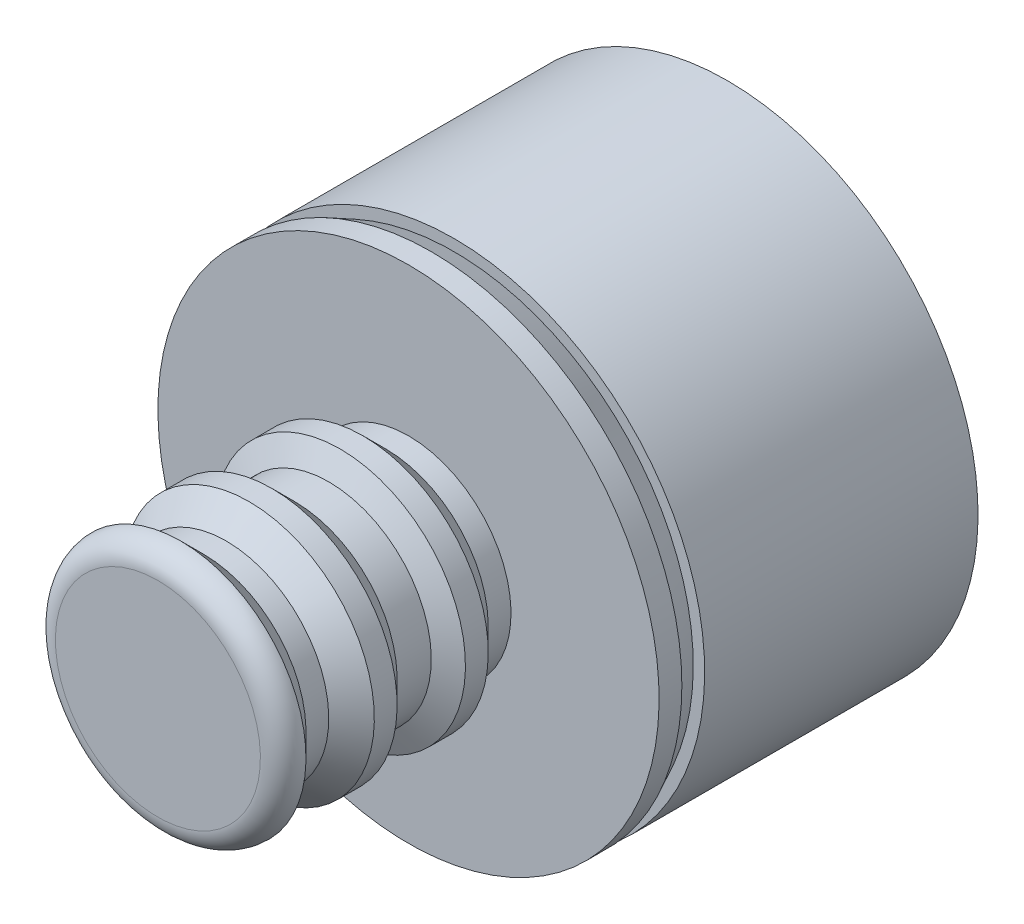
ISO-10303-21;
HEADER;
FILE_DESCRIPTION(('STEP AP214'),'2;1');
FILE_NAME('part.step','',(''),(''),'','','');
FILE_SCHEMA(('AUTOMOTIVE_DESIGN { 1 0 10303 214 1 1 1 1 }'));
ENDSEC;
DATA;
#1=APPLICATION_CONTEXT('core data for automotive mechanical design processes');
#2=APPLICATION_PROTOCOL_DEFINITION('international standard','automotive_design',2000,#1);
#3=PRODUCT_CONTEXT('',#1,'mechanical');
#4=PRODUCT('Part','Part','',(#3));
#5=PRODUCT_RELATED_PRODUCT_CATEGORY('part','',(#4));
#6=PRODUCT_DEFINITION_FORMATION('','',#4);
#7=PRODUCT_DEFINITION_CONTEXT('part definition',#1,'design');
#8=PRODUCT_DEFINITION('design','',#6,#7);
#9=PRODUCT_DEFINITION_SHAPE('','',#8);
#10=(LENGTH_UNIT() NAMED_UNIT(*) SI_UNIT(.MILLI.,.METRE.));
#11=(NAMED_UNIT(*) PLANE_ANGLE_UNIT() SI_UNIT($,.RADIAN.));
#12=(NAMED_UNIT(*) SI_UNIT($,.STERADIAN.) SOLID_ANGLE_UNIT());
#13=UNCERTAINTY_MEASURE_WITH_UNIT(LENGTH_MEASURE(1.E-05),#10,'distance_accuracy_value','');
#14=(GEOMETRIC_REPRESENTATION_CONTEXT(3) GLOBAL_UNCERTAINTY_ASSIGNED_CONTEXT((#13)) GLOBAL_UNIT_ASSIGNED_CONTEXT((#10,
#11,#12)) REPRESENTATION_CONTEXT('',''));
#15=CARTESIAN_POINT('',(0.,0.,0.));
#16=DIRECTION('',(0.,0.,1.));
#17=DIRECTION('',(1.,0.,0.));
#18=AXIS2_PLACEMENT_3D('',#15,#16,#17);
#19=CARTESIAN_POINT('',(0.,5.25,27.));
#20=DIRECTION('',(0.,0.,1.));
#21=DIRECTION('',(0.,-1.,0.));
#22=AXIS2_PLACEMENT_3D('',#19,#20,#21);
#23=PLANE('',#22);
#24=CARTESIAN_POINT('',(0.,2.5,27.));
#25=DIRECTION('',(0.,0.,-1.));
#26=DIRECTION('',(0.,1.,0.));
#27=AXIS2_PLACEMENT_3D('',#24,#25,#26);
#28=CIRCLE('',#27,4.5);
#29=CARTESIAN_POINT('',(0.,7.,27.));
#30=VERTEX_POINT('',#29);
#31=EDGE_CURVE('E103',#30,#30,#28,.T.);
#32=ORIENTED_EDGE('',*,*,#31,.F.);
#33=EDGE_LOOP('',(#32));
#34=FACE_BOUND('',#33,.T.);
#35=ADVANCED_FACE('F14',(#34),#23,.T.);
#36=CARTESIAN_POINT('',(0.,2.5,26.));
#37=DIRECTION('',(0.,0.,-1.));
#38=DIRECTION('',(-1.,0.,0.));
#39=AXIS2_PLACEMENT_3D('',#36,#37,#38);
#40=TOROIDAL_SURFACE('',#39,4.5,1.);
#41=CARTESIAN_POINT('',(0.,2.5,26.0000000000105));
#42=DIRECTION('',(0.,0.,1.));
#43=DIRECTION('',(0.,1.,0.));
#44=AXIS2_PLACEMENT_3D('',#41,#42,#43);
#45=CIRCLE('',#44,5.5000000000382);
#46=CARTESIAN_POINT('',(0.,8.0000000000382,26.0000000000105));
#47=VERTEX_POINT('',#46);
#48=EDGE_CURVE('E98',#47,#47,#45,.F.);
#49=ORIENTED_EDGE('',*,*,#48,.F.);
#50=EDGE_LOOP('',(#49));
#51=FACE_BOUND('',#50,.T.);
#52=ORIENTED_EDGE('',*,*,#31,.T.);
#53=EDGE_LOOP('',(#52));
#54=FACE_BOUND('',#53,.T.);
#55=ADVANCED_FACE('F110',(#51,#54),#40,.T.);
#56=CARTESIAN_POINT('',(0.,2.5,26.0000000000105));
#57=DIRECTION('',(0.,0.,1.));
#58=DIRECTION('',(0.,-1.,0.));
#59=AXIS2_PLACEMENT_3D('',#56,#57,#58);
#60=CONICAL_SURFACE('',#59,5.5000000000382,0.785398163397448);
#61=ORIENTED_EDGE('',*,*,#48,.T.);
#62=EDGE_LOOP('',(#61));
#63=FACE_BOUND('',#62,.T.);
#64=CARTESIAN_POINT('',(0.,2.5,25.));
#65=DIRECTION('',(0.,0.,-1.));
#66=DIRECTION('',(0.,1.,0.));
#67=AXIS2_PLACEMENT_3D('',#64,#65,#66);
#68=CIRCLE('',#67,4.5);
#69=CARTESIAN_POINT('',(0.,7.,25.));
#70=VERTEX_POINT('',#69);
#71=EDGE_CURVE('E93',#70,#70,#68,.T.);
#72=ORIENTED_EDGE('',*,*,#71,.F.);
#73=EDGE_LOOP('',(#72));
#74=FACE_BOUND('',#73,.T.);
#75=ADVANCED_FACE('F114',(#63,#74),#60,.T.);
#76=CARTESIAN_POINT('',(0.,2.5,24.5));
#77=DIRECTION('',(0.,0.,-1.));
#78=DIRECTION('',(0.,1.,0.));
#79=AXIS2_PLACEMENT_3D('',#76,#77,#78);
#80=CYLINDRICAL_SURFACE('',#79,4.5);
#81=ORIENTED_EDGE('',*,*,#71,.T.);
#82=EDGE_LOOP('',(#81));
#83=FACE_BOUND('',#82,.T.);
#84=CARTESIAN_POINT('',(0.,2.5,23.9999999999441));
#85=DIRECTION('',(0.,0.,-1.));
#86=DIRECTION('',(0.,1.,0.));
#87=AXIS2_PLACEMENT_3D('',#84,#85,#86);
#88=CIRCLE('',#87,4.500000000005);
#89=CARTESIAN_POINT('',(0.,7.000000000005,23.9999999999441));
#90=VERTEX_POINT('',#89);
#91=EDGE_CURVE('E88',#90,#90,#88,.T.);
#92=ORIENTED_EDGE('',*,*,#91,.F.);
#93=EDGE_LOOP('',(#92));
#94=FACE_BOUND('',#93,.T.);
#95=ADVANCED_FACE('F118',(#83,#94),#80,.T.);
#96=CARTESIAN_POINT('',(0.,2.5,23.0000000000246));
#97=DIRECTION('',(0.,0.,-1.));
#98=DIRECTION('',(0.,1.,0.));
#99=AXIS2_PLACEMENT_3D('',#96,#97,#98);
#100=CONICAL_SURFACE('',#99,5.49999999992451,0.785398163397448);
#101=ORIENTED_EDGE('',*,*,#91,.T.);
#102=EDGE_LOOP('',(#101));
#103=FACE_BOUND('',#102,.T.);
#104=CARTESIAN_POINT('',(0.,2.5,23.));
#105=DIRECTION('',(0.,0.,-1.));
#106=DIRECTION('',(0.,1.,0.));
#107=AXIS2_PLACEMENT_3D('',#104,#105,#106);
#108=CIRCLE('',#107,5.5);
#109=CARTESIAN_POINT('',(0.,8.,23.));
#110=VERTEX_POINT('',#109);
#111=EDGE_CURVE('E83',#110,#110,#108,.T.);
#112=ORIENTED_EDGE('',*,*,#111,.F.);
#113=EDGE_LOOP('',(#112));
#114=FACE_BOUND('',#113,.T.);
#115=ADVANCED_FACE('F122',(#103,#114),#100,.T.);
#116=CARTESIAN_POINT('',(0.,2.5,22.5));
#117=DIRECTION('',(0.,0.,-1.));
#118=DIRECTION('',(0.,1.,0.));
#119=AXIS2_PLACEMENT_3D('',#116,#117,#118);
#120=CYLINDRICAL_SURFACE('',#119,5.5);
#121=ORIENTED_EDGE('',*,*,#111,.T.);
#122=EDGE_LOOP('',(#121));
#123=FACE_BOUND('',#122,.T.);
#124=CARTESIAN_POINT('',(0.,2.5,21.9999999999914));
#125=DIRECTION('',(0.,0.,1.));
#126=DIRECTION('',(0.,1.,0.));
#127=AXIS2_PLACEMENT_3D('',#124,#125,#126);
#128=CIRCLE('',#127,5.5000000000382);
#129=CARTESIAN_POINT('',(0.,8.0000000000382,21.9999999999914));
#130=VERTEX_POINT('',#129);
#131=EDGE_CURVE('E78',#130,#130,#128,.F.);
#132=ORIENTED_EDGE('',*,*,#131,.F.);
#133=EDGE_LOOP('',(#132));
#134=FACE_BOUND('',#133,.T.);
#135=ADVANCED_FACE('F126',(#123,#134),#120,.T.);
#136=CARTESIAN_POINT('',(0.,2.5,21.9999999999914));
#137=DIRECTION('',(0.,0.,1.));
#138=DIRECTION('',(0.,-1.,0.));
#139=AXIS2_PLACEMENT_3D('',#136,#137,#138);
#140=CONICAL_SURFACE('',#139,5.5000000000382,0.785398163397448);
#141=ORIENTED_EDGE('',*,*,#131,.T.);
#142=EDGE_LOOP('',(#141));
#143=FACE_BOUND('',#142,.T.);
#144=CARTESIAN_POINT('',(0.,2.5,21.));
#145=DIRECTION('',(0.,0.,-1.));
#146=DIRECTION('',(0.,1.,0.));
#147=AXIS2_PLACEMENT_3D('',#144,#145,#146);
#148=CIRCLE('',#147,4.5);
#149=CARTESIAN_POINT('',(0.,7.,21.));
#150=VERTEX_POINT('',#149);
#151=EDGE_CURVE('E73',#150,#150,#148,.T.);
#152=ORIENTED_EDGE('',*,*,#151,.F.);
#153=EDGE_LOOP('',(#152));
#154=FACE_BOUND('',#153,.T.);
#155=ADVANCED_FACE('F130',(#143,#154),#140,.T.);
#156=CARTESIAN_POINT('',(0.,2.5,20.25));
#157=DIRECTION('',(0.,0.,-1.));
#158=DIRECTION('',(0.,1.,0.));
#159=AXIS2_PLACEMENT_3D('',#156,#157,#158);
#160=CYLINDRICAL_SURFACE('',#159,4.5);
#161=ORIENTED_EDGE('',*,*,#151,.T.);
#162=EDGE_LOOP('',(#161));
#163=FACE_BOUND('',#162,.T.);
#164=CARTESIAN_POINT('',(0.,2.5,19.4999999999936));
#165=DIRECTION('',(0.,0.,-1.));
#166=DIRECTION('',(0.,1.,0.));
#167=AXIS2_PLACEMENT_3D('',#164,#165,#166);
#168=CIRCLE('',#167,4.500000000005);
#169=CARTESIAN_POINT('',(0.,7.000000000005,19.4999999999936));
#170=VERTEX_POINT('',#169);
#171=EDGE_CURVE('E68',#170,#170,#168,.T.);
#172=ORIENTED_EDGE('',*,*,#171,.F.);
#173=EDGE_LOOP('',(#172));
#174=FACE_BOUND('',#173,.T.);
#175=ADVANCED_FACE('F134',(#163,#174),#160,.T.);
#176=CARTESIAN_POINT('',(0.,2.5,19.0000000000339));
#177=DIRECTION('',(0.,0.,-1.));
#178=DIRECTION('',(0.,1.,0.));
#179=AXIS2_PLACEMENT_3D('',#176,#177,#178);
#180=CONICAL_SURFACE('',#179,5.49999999986767,1.10714871777135);
#181=ORIENTED_EDGE('',*,*,#171,.T.);
#182=EDGE_LOOP('',(#181));
#183=FACE_BOUND('',#182,.T.);
#184=CARTESIAN_POINT('',(0.,2.5,19.));
#185=DIRECTION('',(0.,0.,-1.));
#186=DIRECTION('',(0.,1.,0.));
#187=AXIS2_PLACEMENT_3D('',#184,#185,#186);
#188=CIRCLE('',#187,5.49999999999999);
#189=CARTESIAN_POINT('',(0.,7.99999999999999,19.));
#190=VERTEX_POINT('',#189);
#191=EDGE_CURVE('E56',#190,#190,#188,.T.);
#192=ORIENTED_EDGE('',*,*,#191,.F.);
#193=EDGE_LOOP('',(#192));
#194=FACE_BOUND('',#193,.T.);
#195=ADVANCED_FACE('F138',(#183,#194),#180,.T.);
#196=CARTESIAN_POINT('',(0.,2.5,18.5));
#197=DIRECTION('',(0.,0.,-1.));
#198=DIRECTION('',(0.,1.,0.));
#199=AXIS2_PLACEMENT_3D('',#196,#197,#198);
#200=CYLINDRICAL_SURFACE('',#199,5.49999999999999);
#201=ORIENTED_EDGE('',*,*,#191,.T.);
#202=EDGE_LOOP('',(#201));
#203=FACE_BOUND('',#202,.T.);
#204=CARTESIAN_POINT('',(0.,2.5,18.0000000000291));
#205=DIRECTION('',(0.,0.,1.));
#206=DIRECTION('',(0.,1.,0.));
#207=AXIS2_PLACEMENT_3D('',#204,#205,#206);
#208=CIRCLE('',#207,5.5000000000382);
#209=CARTESIAN_POINT('',(0.,8.0000000000382,18.0000000000291));
#210=VERTEX_POINT('',#209);
#211=EDGE_CURVE('E51',#210,#210,#208,.F.);
#212=ORIENTED_EDGE('',*,*,#211,.F.);
#213=EDGE_LOOP('',(#212));
#214=FACE_BOUND('',#213,.T.);
#215=ADVANCED_FACE('F142',(#203,#214),#200,.T.);
#216=CARTESIAN_POINT('',(0.,2.5,18.0000000000291));
#217=DIRECTION('',(0.,0.,1.));
#218=DIRECTION('',(0.,-1.,0.));
#219=AXIS2_PLACEMENT_3D('',#216,#217,#218);
#220=CONICAL_SURFACE('',#219,5.5000000000382,0.785398163369027);
#221=ORIENTED_EDGE('',*,*,#211,.T.);
#222=EDGE_LOOP('',(#221));
#223=FACE_BOUND('',#222,.T.);
#224=CARTESIAN_POINT('',(0.,2.5,17.));
#225=DIRECTION('',(0.,0.,-1.));
#226=DIRECTION('',(0.,1.,0.));
#227=AXIS2_PLACEMENT_3D('',#224,#225,#226);
#228=CIRCLE('',#227,4.49999999999999);
#229=CARTESIAN_POINT('',(0.,6.99999999999999,17.));
#230=VERTEX_POINT('',#229);
#231=EDGE_CURVE('E47',#230,#230,#228,.T.);
#232=ORIENTED_EDGE('',*,*,#231,.F.);
#233=EDGE_LOOP('',(#232));
#234=FACE_BOUND('',#233,.T.);
#235=ADVANCED_FACE('F146',(#223,#234),#220,.T.);
#236=CARTESIAN_POINT('',(0.,2.5,16.5));
#237=DIRECTION('',(0.,0.,-1.));
#238=DIRECTION('',(0.,1.,0.));
#239=AXIS2_PLACEMENT_3D('',#236,#237,#238);
#240=CYLINDRICAL_SURFACE('',#239,4.49999999999999);
#241=ORIENTED_EDGE('',*,*,#231,.T.);
#242=EDGE_LOOP('',(#241));
#243=FACE_BOUND('',#242,.T.);
#244=CARTESIAN_POINT('',(0.,2.5,16.));
#245=DIRECTION('',(0.,0.,-1.));
#246=DIRECTION('',(0.,1.,0.));
#247=AXIS2_PLACEMENT_3D('',#244,#245,#246);
#248=CIRCLE('',#247,4.49999999999999);
#249=CARTESIAN_POINT('',(0.,6.99999999999999,16.));
#250=VERTEX_POINT('',#249);
#251=EDGE_CURVE('E18',#250,#250,#248,.T.);
#252=ORIENTED_EDGE('',*,*,#251,.F.);
#253=EDGE_LOOP('',(#252));
#254=FACE_BOUND('',#253,.T.);
#255=ADVANCED_FACE('F150',(#243,#254),#240,.T.);
#256=CARTESIAN_POINT('',(0.,10.25,16.));
#257=DIRECTION('',(0.,0.,1.));
#258=DIRECTION('',(0.,-1.,0.));
#259=AXIS2_PLACEMENT_3D('',#256,#257,#258);
#260=PLANE('',#259);
#261=ORIENTED_EDGE('',*,*,#251,.T.);
#262=EDGE_LOOP('',(#261));
#263=FACE_BOUND('',#262,.T.);
#264=CARTESIAN_POINT('',(0.,2.5,16.));
#265=DIRECTION('',(0.,0.,-1.));
#266=DIRECTION('',(0.,1.,0.));
#267=AXIS2_PLACEMENT_3D('',#264,#265,#266);
#268=CIRCLE('',#267,11.);
#269=CARTESIAN_POINT('',(0.,13.5,16.));
#270=VERTEX_POINT('',#269);
#271=EDGE_CURVE('E42',#270,#270,#268,.T.);
#272=ORIENTED_EDGE('',*,*,#271,.F.);
#273=EDGE_LOOP('',(#272));
#274=FACE_BOUND('',#273,.T.);
#275=ADVANCED_FACE('F154',(#263,#274),#260,.T.);
#276=CARTESIAN_POINT('',(0.,7.5,10.));
#277=DIRECTION('',(0.,0.,-1.));
#278=DIRECTION('',(0.,1.,0.));
#279=AXIS2_PLACEMENT_3D('',#276,#277,#278);
#280=PLANE('',#279);
#281=CARTESIAN_POINT('',(0.,2.5,10.));
#282=DIRECTION('',(0.,0.,-1.));
#283=DIRECTION('',(0.,1.,0.));
#284=AXIS2_PLACEMENT_3D('',#281,#282,#283);
#285=CIRCLE('',#284,10.);
#286=CARTESIAN_POINT('',(0.,12.5,10.));
#287=VERTEX_POINT('',#286);
#288=EDGE_CURVE('E40',#287,#287,#285,.T.);
#289=ORIENTED_EDGE('',*,*,#288,.T.);
#290=EDGE_LOOP('',(#289));
#291=FACE_BOUND('',#290,.T.);
#292=ADVANCED_FACE('F157',(#291),#280,.T.);
#293=CARTESIAN_POINT('',(0.,2.5,15.5));
#294=DIRECTION('',(0.,0.,-1.));
#295=DIRECTION('',(0.,1.,0.));
#296=AXIS2_PLACEMENT_3D('',#293,#294,#295);
#297=CYLINDRICAL_SURFACE('',#296,11.);
#298=ORIENTED_EDGE('',*,*,#271,.T.);
#299=EDGE_LOOP('',(#298));
#300=FACE_BOUND('',#299,.T.);
#301=CARTESIAN_POINT('',(0.,2.5,15.));
#302=DIRECTION('',(0.,0.,1.));
#303=DIRECTION('',(0.,1.,0.));
#304=AXIS2_PLACEMENT_3D('',#301,#302,#303);
#305=CIRCLE('',#304,11.);
#306=CARTESIAN_POINT('',(0.,13.5,15.));
#307=VERTEX_POINT('',#306);
#308=EDGE_CURVE('E39',#307,#307,#305,.F.);
#309=ORIENTED_EDGE('',*,*,#308,.F.);
#310=EDGE_LOOP('',(#309));
#311=FACE_BOUND('',#310,.T.);
#312=ADVANCED_FACE('F160',(#300,#311),#297,.T.);
#313=CARTESIAN_POINT('',(0.,2.5,6.00000000000001));
#314=DIRECTION('',(0.,0.,-1.));
#315=DIRECTION('',(0.,1.,0.));
#316=AXIS2_PLACEMENT_3D('',#313,#314,#315);
#317=CYLINDRICAL_SURFACE('',#316,10.);
#318=CARTESIAN_POINT('',(0.,2.5,2.00000000000002));
#319=DIRECTION('',(0.,0.,-1.));
#320=DIRECTION('',(0.,1.,0.));
#321=AXIS2_PLACEMENT_3D('',#318,#319,#320);
#322=CIRCLE('',#321,10.);
#323=CARTESIAN_POINT('',(0.,12.5,2.00000000000002));
#324=VERTEX_POINT('',#323);
#325=EDGE_CURVE('E36',#324,#324,#322,.F.);
#326=ORIENTED_EDGE('',*,*,#325,.F.);
#327=EDGE_LOOP('',(#326));
#328=FACE_BOUND('',#327,.T.);
#329=ORIENTED_EDGE('',*,*,#288,.F.);
#330=EDGE_LOOP('',(#329));
#331=FACE_BOUND('',#330,.T.);
#332=ADVANCED_FACE('F164',(#328,#331),#317,.F.);
#333=CARTESIAN_POINT('',(0.,2.5,15.));
#334=DIRECTION('',(0.,0.,1.));
#335=DIRECTION('',(0.,-1.,0.));
#336=AXIS2_PLACEMENT_3D('',#333,#334,#335);
#337=CONICAL_SURFACE('',#336,11.,0.46364760900081);
#338=ORIENTED_EDGE('',*,*,#308,.T.);
#339=EDGE_LOOP('',(#338));
#340=FACE_BOUND('',#339,.T.);
#341=CARTESIAN_POINT('',(0.,2.5,14.));
#342=DIRECTION('',(0.,0.,1.));
#343=DIRECTION('',(0.,-1.,0.));
#344=AXIS2_PLACEMENT_3D('',#341,#342,#343);
#345=CIRCLE('',#344,10.5);
#346=CARTESIAN_POINT('',(0.,-8.,14.));
#347=VERTEX_POINT('',#346);
#348=EDGE_CURVE('E27',#347,#347,#345,.F.);
#349=ORIENTED_EDGE('',*,*,#348,.F.);
#350=EDGE_LOOP('',(#349));
#351=FACE_BOUND('',#350,.T.);
#352=ADVANCED_FACE('F167',(#340,#351),#337,.T.);
#353=CARTESIAN_POINT('',(0.,13.,2.00000000000002));
#354=DIRECTION('',(0.,0.,-1.));
#355=DIRECTION('',(0.,1.,0.));
#356=AXIS2_PLACEMENT_3D('',#353,#354,#355);
#357=PLANE('',#356);
#358=ORIENTED_EDGE('',*,*,#325,.T.);
#359=EDGE_LOOP('',(#358));
#360=FACE_BOUND('',#359,.T.);
#361=CARTESIAN_POINT('',(0.,2.5,2.00000000000002));
#362=DIRECTION('',(0.,0.,-1.));
#363=DIRECTION('',(0.,1.,0.));
#364=AXIS2_PLACEMENT_3D('',#361,#362,#363);
#365=CIRCLE('',#364,11.);
#366=CARTESIAN_POINT('',(0.,13.5,2.00000000000002));
#367=VERTEX_POINT('',#366);
#368=EDGE_CURVE('E22',#367,#367,#365,.F.);
#369=ORIENTED_EDGE('',*,*,#368,.F.);
#370=EDGE_LOOP('',(#369));
#371=FACE_BOUND('',#370,.T.);
#372=ADVANCED_FACE('F171',(#360,#371),#357,.T.);
#373=CARTESIAN_POINT('',(0.,13.25,14.));
#374=DIRECTION('',(0.,0.,1.));
#375=DIRECTION('',(0.,-1.,0.));
#376=AXIS2_PLACEMENT_3D('',#373,#374,#375);
#377=PLANE('',#376);
#378=ORIENTED_EDGE('',*,*,#348,.T.);
#379=EDGE_LOOP('',(#378));
#380=FACE_BOUND('',#379,.T.);
#381=CARTESIAN_POINT('',(0.,2.5,14.));
#382=DIRECTION('',(0.,0.,-1.));
#383=DIRECTION('',(0.,1.,0.));
#384=AXIS2_PLACEMENT_3D('',#381,#382,#383);
#385=CIRCLE('',#384,11.);
#386=CARTESIAN_POINT('',(0.,13.5,14.));
#387=VERTEX_POINT('',#386);
#388=EDGE_CURVE('E10',#387,#387,#385,.T.);
#389=ORIENTED_EDGE('',*,*,#388,.F.);
#390=EDGE_LOOP('',(#389));
#391=FACE_BOUND('',#390,.T.);
#392=ADVANCED_FACE('F175',(#380,#391),#377,.T.);
#393=CARTESIAN_POINT('',(0.,2.5,8.00000000000001));
#394=DIRECTION('',(0.,0.,-1.));
#395=DIRECTION('',(0.,1.,0.));
#396=AXIS2_PLACEMENT_3D('',#393,#394,#395);
#397=CYLINDRICAL_SURFACE('',#396,11.);
#398=ORIENTED_EDGE('',*,*,#388,.T.);
#399=EDGE_LOOP('',(#398));
#400=FACE_BOUND('',#399,.T.);
#401=ORIENTED_EDGE('',*,*,#368,.T.);
#402=EDGE_LOOP('',(#401));
#403=FACE_BOUND('',#402,.T.);
#404=ADVANCED_FACE('F179',(#400,#403),#397,.T.);
#405=CLOSED_SHELL('',(#35,#55,#75,#95,#115,#135,#155,#175,#195,#215,#235,#255,#275,#292,#312,
#332,#352,#372,#392,#404));
#406=MANIFOLD_SOLID_BREP('B1',#405);
#407=ADVANCED_BREP_SHAPE_REPRESENTATION('',(#18,#406),#14);
#408=SHAPE_DEFINITION_REPRESENTATION(#9,#407);
ENDSEC;
END-ISO-10303-21;
